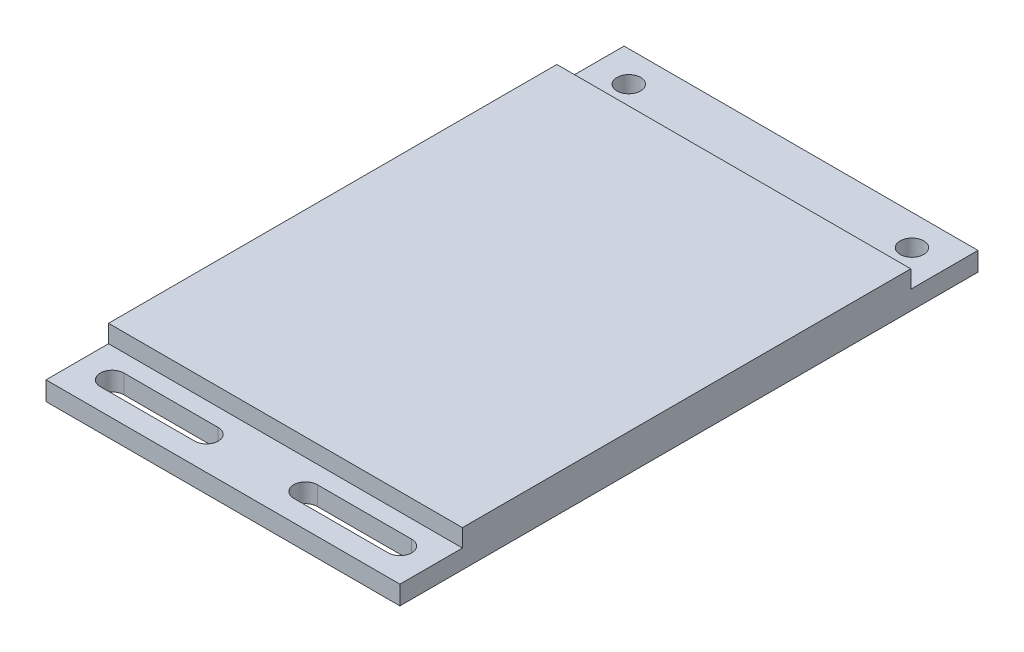
ISO-10303-21;
HEADER;
FILE_DESCRIPTION(('STEP AP214'),'2;1');
FILE_NAME('part.step','',(''),(''),'','','');
FILE_SCHEMA(('AUTOMOTIVE_DESIGN { 1 0 10303 214 1 1 1 1 }'));
ENDSEC;
DATA;
#1=APPLICATION_CONTEXT('core data for automotive mechanical design processes');
#2=APPLICATION_PROTOCOL_DEFINITION('international standard','automotive_design',2000,#1);
#3=PRODUCT_CONTEXT('',#1,'mechanical');
#4=PRODUCT('Part','Part','',(#3));
#5=PRODUCT_RELATED_PRODUCT_CATEGORY('part','',(#4));
#6=PRODUCT_DEFINITION_FORMATION('','',#4);
#7=PRODUCT_DEFINITION_CONTEXT('part definition',#1,'design');
#8=PRODUCT_DEFINITION('design','',#6,#7);
#9=PRODUCT_DEFINITION_SHAPE('','',#8);
#10=(LENGTH_UNIT() NAMED_UNIT(*) SI_UNIT(.MILLI.,.METRE.));
#11=(NAMED_UNIT(*) PLANE_ANGLE_UNIT() SI_UNIT($,.RADIAN.));
#12=(NAMED_UNIT(*) SI_UNIT($,.STERADIAN.) SOLID_ANGLE_UNIT());
#13=UNCERTAINTY_MEASURE_WITH_UNIT(LENGTH_MEASURE(1.E-05),#10,'distance_accuracy_value','');
#14=(GEOMETRIC_REPRESENTATION_CONTEXT(3) GLOBAL_UNCERTAINTY_ASSIGNED_CONTEXT((#13)) GLOBAL_UNIT_ASSIGNED_CONTEXT((#10,
#11,#12)) REPRESENTATION_CONTEXT('',''));
#15=CARTESIAN_POINT('',(0.,0.,0.));
#16=DIRECTION('',(0.,0.,1.));
#17=DIRECTION('',(1.,0.,0.));
#18=AXIS2_PLACEMENT_3D('',#15,#16,#17);
#19=CARTESIAN_POINT('',(0.,0.,0.));
#20=DIRECTION('',(0.,1.,0.));
#21=DIRECTION('',(0.,0.,1.));
#22=AXIS2_PLACEMENT_3D('',#19,#20,#21);
#23=PLANE('',#22);
#24=DIRECTION('',(0.,0.,1.));
#25=VECTOR('',#24,1.);
#26=CARTESIAN_POINT('',(30.,0.,0.));
#27=LINE('',#26,#25);
#28=CARTESIAN_POINT('',(30.,0.,0.));
#29=VERTEX_POINT('',#28);
#30=CARTESIAN_POINT('',(30.,0.,49.));
#31=VERTEX_POINT('',#30);
#32=EDGE_CURVE('E302',#29,#31,#27,.T.);
#33=ORIENTED_EDGE('',*,*,#32,.T.);
#34=DIRECTION('',(1.,0.,0.));
#35=VECTOR('',#34,1.);
#36=CARTESIAN_POINT('',(0.,0.,49.));
#37=LINE('',#36,#35);
#38=CARTESIAN_POINT('',(0.,0.,49.));
#39=VERTEX_POINT('',#38);
#40=EDGE_CURVE('E234',#39,#31,#37,.T.);
#41=ORIENTED_EDGE('',*,*,#40,.F.);
#42=DIRECTION('',(0.,0.,1.));
#43=VECTOR('',#42,1.);
#44=CARTESIAN_POINT('',(0.,0.,0.));
#45=LINE('',#44,#43);
#46=CARTESIAN_POINT('',(0.,0.,0.));
#47=VERTEX_POINT('',#46);
#48=EDGE_CURVE('E308',#47,#39,#45,.T.);
#49=ORIENTED_EDGE('',*,*,#48,.F.);
#50=DIRECTION('',(1.,0.,0.));
#51=VECTOR('',#50,1.);
#52=CARTESIAN_POINT('',(0.,0.,0.));
#53=LINE('',#52,#51);
#54=EDGE_CURVE('E305',#47,#29,#53,.T.);
#55=ORIENTED_EDGE('',*,*,#54,.T.);
#56=EDGE_LOOP('',(#33,#41,#49,#55));
#57=FACE_BOUND('',#56,.T.);
#58=CARTESIAN_POINT('',(3.,0.,2.6));
#59=DIRECTION('',(0.,1.,0.));
#60=DIRECTION('',(0.,0.,1.));
#61=AXIS2_PLACEMENT_3D('',#58,#59,#60);
#62=CIRCLE('',#61,1.);
#63=CARTESIAN_POINT('',(3.,0.,3.6));
#64=VERTEX_POINT('',#63);
#65=EDGE_CURVE('E299',#64,#64,#62,.T.);
#66=ORIENTED_EDGE('',*,*,#65,.T.);
#67=EDGE_LOOP('',(#66));
#68=FACE_BOUND('',#67,.T.);
#69=CARTESIAN_POINT('',(27.,0.,2.6));
#70=DIRECTION('',(0.,1.,0.));
#71=DIRECTION('',(0.,0.,1.));
#72=AXIS2_PLACEMENT_3D('',#69,#70,#71);
#73=CIRCLE('',#72,1.);
#74=CARTESIAN_POINT('',(27.,0.,3.6));
#75=VERTEX_POINT('',#74);
#76=EDGE_CURVE('E296',#75,#75,#73,.T.);
#77=ORIENTED_EDGE('',*,*,#76,.T.);
#78=EDGE_LOOP('',(#77));
#79=FACE_BOUND('',#78,.T.);
#80=CARTESIAN_POINT('',(10.8,0.,46.2));
#81=DIRECTION('',(0.,1.,0.));
#82=DIRECTION('',(0.,0.,1.));
#83=AXIS2_PLACEMENT_3D('',#80,#81,#82);
#84=CIRCLE('',#83,1.);
#85=CARTESIAN_POINT('',(10.8,0.,47.2));
#86=VERTEX_POINT('',#85);
#87=CARTESIAN_POINT('',(10.8,0.,45.2));
#88=VERTEX_POINT('',#87);
#89=EDGE_CURVE('E284',#86,#88,#84,.T.);
#90=ORIENTED_EDGE('',*,*,#89,.T.);
#91=DIRECTION('',(1.,0.,0.));
#92=VECTOR('',#91,1.);
#93=CARTESIAN_POINT('',(0.,0.,45.2));
#94=LINE('',#93,#92);
#95=CARTESIAN_POINT('',(2.80000000000001,0.,45.2));
#96=VERTEX_POINT('',#95);
#97=EDGE_CURVE('E293',#96,#88,#94,.T.);
#98=ORIENTED_EDGE('',*,*,#97,.F.);
#99=CARTESIAN_POINT('',(2.80000000000001,0.,46.2));
#100=DIRECTION('',(0.,1.,0.));
#101=DIRECTION('',(0.,0.,1.));
#102=AXIS2_PLACEMENT_3D('',#99,#100,#101);
#103=CIRCLE('',#102,1.);
#104=CARTESIAN_POINT('',(2.80000000000001,0.,47.2));
#105=VERTEX_POINT('',#104);
#106=EDGE_CURVE('E290',#96,#105,#103,.T.);
#107=ORIENTED_EDGE('',*,*,#106,.T.);
#108=DIRECTION('',(1.,0.,0.));
#109=VECTOR('',#108,1.);
#110=CARTESIAN_POINT('',(0.,0.,47.2));
#111=LINE('',#110,#109);
#112=EDGE_CURVE('E287',#105,#86,#111,.T.);
#113=ORIENTED_EDGE('',*,*,#112,.T.);
#114=EDGE_LOOP('',(#90,#98,#107,#113));
#115=FACE_BOUND('',#114,.T.);
#116=CARTESIAN_POINT('',(19.2,0.,46.2));
#117=DIRECTION('',(0.,1.,0.));
#118=DIRECTION('',(0.,0.,1.));
#119=AXIS2_PLACEMENT_3D('',#116,#117,#118);
#120=CIRCLE('',#119,1.);
#121=CARTESIAN_POINT('',(19.2,0.,45.2));
#122=VERTEX_POINT('',#121);
#123=CARTESIAN_POINT('',(19.2,0.,47.2));
#124=VERTEX_POINT('',#123);
#125=EDGE_CURVE('E229',#122,#124,#120,.T.);
#126=ORIENTED_EDGE('',*,*,#125,.T.);
#127=DIRECTION('',(1.,0.,0.));
#128=VECTOR('',#127,1.);
#129=CARTESIAN_POINT('',(0.,0.,47.2));
#130=LINE('',#129,#128);
#131=CARTESIAN_POINT('',(27.2,0.,47.2));
#132=VERTEX_POINT('',#131);
#133=EDGE_CURVE('E281',#124,#132,#130,.T.);
#134=ORIENTED_EDGE('',*,*,#133,.T.);
#135=CARTESIAN_POINT('',(27.2,0.,46.2));
#136=DIRECTION('',(0.,1.,0.));
#137=DIRECTION('',(0.,0.,1.));
#138=AXIS2_PLACEMENT_3D('',#135,#136,#137);
#139=CIRCLE('',#138,1.);
#140=CARTESIAN_POINT('',(27.2,0.,45.2));
#141=VERTEX_POINT('',#140);
#142=EDGE_CURVE('E278',#132,#141,#139,.T.);
#143=ORIENTED_EDGE('',*,*,#142,.T.);
#144=DIRECTION('',(1.,0.,0.));
#145=VECTOR('',#144,1.);
#146=CARTESIAN_POINT('',(0.,0.,45.2));
#147=LINE('',#146,#145);
#148=EDGE_CURVE('E275',#122,#141,#147,.T.);
#149=ORIENTED_EDGE('',*,*,#148,.F.);
#150=EDGE_LOOP('',(#126,#134,#143,#149));
#151=FACE_BOUND('',#150,.T.);
#152=DIRECTION('',(0.,0.,1.));
#153=VECTOR('',#152,1.);
#154=CARTESIAN_POINT('',(19.2,0.,40.5));
#155=LINE('',#154,#153);
#156=CARTESIAN_POINT('',(19.2,0.,35.5));
#157=VERTEX_POINT('',#156);
#158=CARTESIAN_POINT('',(19.2,0.,40.5));
#159=VERTEX_POINT('',#158);
#160=EDGE_CURVE('E196',#157,#159,#155,.T.);
#161=ORIENTED_EDGE('',*,*,#160,.F.);
#162=DIRECTION('',(1.,0.,0.));
#163=VECTOR('',#162,1.);
#164=CARTESIAN_POINT('',(19.2,0.,35.5));
#165=LINE('',#164,#163);
#166=CARTESIAN_POINT('',(10.8,0.,35.5));
#167=VERTEX_POINT('',#166);
#168=EDGE_CURVE('E193',#167,#157,#165,.T.);
#169=ORIENTED_EDGE('',*,*,#168,.F.);
#170=DIRECTION('',(0.,0.,-1.));
#171=VECTOR('',#170,1.);
#172=CARTESIAN_POINT('',(10.8,0.,40.5));
#173=LINE('',#172,#171);
#174=CARTESIAN_POINT('',(10.8,0.,40.5));
#175=VERTEX_POINT('',#174);
#176=EDGE_CURVE('E60',#175,#167,#173,.T.);
#177=ORIENTED_EDGE('',*,*,#176,.F.);
#178=DIRECTION('',(-1.,0.,0.));
#179=VECTOR('',#178,1.);
#180=CARTESIAN_POINT('',(19.2,0.,40.5));
#181=LINE('',#180,#179);
#182=EDGE_CURVE('E55',#159,#175,#181,.T.);
#183=ORIENTED_EDGE('',*,*,#182,.F.);
#184=EDGE_LOOP('',(#161,#169,#177,#183));
#185=FACE_BOUND('',#184,.T.);
#186=ADVANCED_FACE('F38',(#57,#68,#79,#115,#151,#185),#23,.F.);
#187=CARTESIAN_POINT('',(0.,1.6,0.));
#188=DIRECTION('',(0.,1.,0.));
#189=DIRECTION('',(0.,0.,1.));
#190=AXIS2_PLACEMENT_3D('',#187,#188,#189);
#191=PLANE('',#190);
#192=DIRECTION('',(-1.,0.,0.));
#193=VECTOR('',#192,1.);
#194=CARTESIAN_POINT('',(0.,1.6,5.7));
#195=LINE('',#194,#193);
#196=CARTESIAN_POINT('',(30.,1.6,5.7));
#197=VERTEX_POINT('',#196);
#198=CARTESIAN_POINT('',(0.,1.6,5.7));
#199=VERTEX_POINT('',#198);
#200=EDGE_CURVE('E200',#197,#199,#195,.T.);
#201=ORIENTED_EDGE('',*,*,#200,.F.);
#202=DIRECTION('',(0.,0.,1.));
#203=VECTOR('',#202,1.);
#204=CARTESIAN_POINT('',(30.,1.6,0.));
#205=LINE('',#204,#203);
#206=CARTESIAN_POINT('',(30.,1.6,0.));
#207=VERTEX_POINT('',#206);
#208=EDGE_CURVE('E260',#207,#197,#205,.T.);
#209=ORIENTED_EDGE('',*,*,#208,.F.);
#210=DIRECTION('',(1.,0.,0.));
#211=VECTOR('',#210,1.);
#212=CARTESIAN_POINT('',(0.,1.6,0.));
#213=LINE('',#212,#211);
#214=CARTESIAN_POINT('',(0.,1.6,0.));
#215=VERTEX_POINT('',#214);
#216=EDGE_CURVE('E263',#215,#207,#213,.T.);
#217=ORIENTED_EDGE('',*,*,#216,.F.);
#218=DIRECTION('',(0.,0.,1.));
#219=VECTOR('',#218,1.);
#220=CARTESIAN_POINT('',(0.,1.6,0.));
#221=LINE('',#220,#219);
#222=EDGE_CURVE('E267',#215,#199,#221,.T.);
#223=ORIENTED_EDGE('',*,*,#222,.T.);
#224=EDGE_LOOP('',(#201,#209,#217,#223));
#225=FACE_BOUND('',#224,.T.);
#226=CARTESIAN_POINT('',(3.,1.6,2.6));
#227=DIRECTION('',(0.,1.,0.));
#228=DIRECTION('',(0.,0.,1.));
#229=AXIS2_PLACEMENT_3D('',#226,#227,#228);
#230=CIRCLE('',#229,1.);
#231=CARTESIAN_POINT('',(3.,1.6,3.6));
#232=VERTEX_POINT('',#231);
#233=EDGE_CURVE('E256',#232,#232,#230,.T.);
#234=ORIENTED_EDGE('',*,*,#233,.F.);
#235=EDGE_LOOP('',(#234));
#236=FACE_BOUND('',#235,.T.);
#237=CARTESIAN_POINT('',(27.,1.6,2.6));
#238=DIRECTION('',(0.,1.,0.));
#239=DIRECTION('',(0.,0.,1.));
#240=AXIS2_PLACEMENT_3D('',#237,#238,#239);
#241=CIRCLE('',#240,1.);
#242=CARTESIAN_POINT('',(27.,1.6,3.6));
#243=VERTEX_POINT('',#242);
#244=EDGE_CURVE('E253',#243,#243,#241,.T.);
#245=ORIENTED_EDGE('',*,*,#244,.F.);
#246=EDGE_LOOP('',(#245));
#247=FACE_BOUND('',#246,.T.);
#248=ADVANCED_FACE('F359',(#225,#236,#247),#191,.T.);
#249=CARTESIAN_POINT('',(30.,1.6,0.));
#250=DIRECTION('',(1.,0.,0.));
#251=DIRECTION('',(0.,0.,-1.));
#252=AXIS2_PLACEMENT_3D('',#249,#250,#251);
#253=PLANE('',#252);
#254=ORIENTED_EDGE('',*,*,#32,.F.);
#255=DIRECTION('',(0.,-1.,0.));
#256=VECTOR('',#255,1.);
#257=CARTESIAN_POINT('',(30.,1.6,0.));
#258=LINE('',#257,#256);
#259=EDGE_CURVE('E11',#207,#29,#258,.T.);
#260=ORIENTED_EDGE('',*,*,#259,.F.);
#261=ORIENTED_EDGE('',*,*,#208,.T.);
#262=DIRECTION('',(0.,-1.,0.));
#263=VECTOR('',#262,1.);
#264=CARTESIAN_POINT('',(30.,3.1,5.7));
#265=LINE('',#264,#263);
#266=CARTESIAN_POINT('',(30.,3.1,5.7));
#267=VERTEX_POINT('',#266);
#268=EDGE_CURVE('E220',#267,#197,#265,.T.);
#269=ORIENTED_EDGE('',*,*,#268,.F.);
#270=DIRECTION('',(0.,0.,-1.));
#271=VECTOR('',#270,1.);
#272=CARTESIAN_POINT('',(30.,3.1,5.7));
#273=LINE('',#272,#271);
#274=CARTESIAN_POINT('',(30.,3.1,43.7));
#275=VERTEX_POINT('',#274);
#276=EDGE_CURVE('E211',#275,#267,#273,.T.);
#277=ORIENTED_EDGE('',*,*,#276,.F.);
#278=DIRECTION('',(0.,-1.,0.));
#279=VECTOR('',#278,1.);
#280=CARTESIAN_POINT('',(30.,3.1,43.7));
#281=LINE('',#280,#279);
#282=CARTESIAN_POINT('',(30.,1.6,43.7));
#283=VERTEX_POINT('',#282);
#284=EDGE_CURVE('E223',#275,#283,#281,.T.);
#285=ORIENTED_EDGE('',*,*,#284,.T.);
#286=CARTESIAN_POINT('',(30.,1.6,49.));
#287=VERTEX_POINT('',#286);
#288=EDGE_CURVE('E259',#283,#287,#205,.T.);
#289=ORIENTED_EDGE('',*,*,#288,.T.);
#290=DIRECTION('',(0.,-1.,0.));
#291=VECTOR('',#290,1.);
#292=CARTESIAN_POINT('',(30.,1.6,49.));
#293=LINE('',#292,#291);
#294=EDGE_CURVE('E313',#287,#31,#293,.T.);
#295=ORIENTED_EDGE('',*,*,#294,.T.);
#296=EDGE_LOOP('',(#254,#260,#261,#269,#277,#285,#289,#295));
#297=FACE_BOUND('',#296,.T.);
#298=ADVANCED_FACE('F365',(#297),#253,.T.);
#299=CARTESIAN_POINT('',(0.,1.6,0.));
#300=DIRECTION('',(0.,0.,-1.));
#301=DIRECTION('',(-1.,0.,0.));
#302=AXIS2_PLACEMENT_3D('',#299,#300,#301);
#303=PLANE('',#302);
#304=ORIENTED_EDGE('',*,*,#54,.F.);
#305=DIRECTION('',(0.,-1.,0.));
#306=VECTOR('',#305,1.);
#307=CARTESIAN_POINT('',(0.,1.6,0.));
#308=LINE('',#307,#306);
#309=EDGE_CURVE('E47',#215,#47,#308,.T.);
#310=ORIENTED_EDGE('',*,*,#309,.F.);
#311=ORIENTED_EDGE('',*,*,#216,.T.);
#312=ORIENTED_EDGE('',*,*,#259,.T.);
#313=EDGE_LOOP('',(#304,#310,#311,#312));
#314=FACE_BOUND('',#313,.T.);
#315=ADVANCED_FACE('F380',(#314),#303,.T.);
#316=CARTESIAN_POINT('',(0.,1.6,0.));
#317=DIRECTION('',(1.,0.,0.));
#318=DIRECTION('',(0.,0.,-1.));
#319=AXIS2_PLACEMENT_3D('',#316,#317,#318);
#320=PLANE('',#319);
#321=ORIENTED_EDGE('',*,*,#48,.T.);
#322=DIRECTION('',(0.,-1.,0.));
#323=VECTOR('',#322,1.);
#324=CARTESIAN_POINT('',(0.,1.6,49.));
#325=LINE('',#324,#323);
#326=CARTESIAN_POINT('',(0.,1.6,49.));
#327=VERTEX_POINT('',#326);
#328=EDGE_CURVE('E315',#327,#39,#325,.T.);
#329=ORIENTED_EDGE('',*,*,#328,.F.);
#330=CARTESIAN_POINT('',(0.,1.6,43.7));
#331=VERTEX_POINT('',#330);
#332=EDGE_CURVE('E266',#331,#327,#221,.T.);
#333=ORIENTED_EDGE('',*,*,#332,.F.);
#334=DIRECTION('',(0.,-1.,0.));
#335=VECTOR('',#334,1.);
#336=CARTESIAN_POINT('',(0.,3.1,43.7));
#337=LINE('',#336,#335);
#338=CARTESIAN_POINT('',(0.,3.1,43.7));
#339=VERTEX_POINT('',#338);
#340=EDGE_CURVE('E226',#339,#331,#337,.T.);
#341=ORIENTED_EDGE('',*,*,#340,.F.);
#342=DIRECTION('',(0.,0.,1.));
#343=VECTOR('',#342,1.);
#344=CARTESIAN_POINT('',(0.,3.1,5.7));
#345=LINE('',#344,#343);
#346=CARTESIAN_POINT('',(0.,3.1,5.7));
#347=VERTEX_POINT('',#346);
#348=EDGE_CURVE('E206',#347,#339,#345,.T.);
#349=ORIENTED_EDGE('',*,*,#348,.F.);
#350=DIRECTION('',(0.,-1.,0.));
#351=VECTOR('',#350,1.);
#352=CARTESIAN_POINT('',(0.,3.1,5.7));
#353=LINE('',#352,#351);
#354=EDGE_CURVE('E214',#347,#199,#353,.T.);
#355=ORIENTED_EDGE('',*,*,#354,.T.);
#356=ORIENTED_EDGE('',*,*,#222,.F.);
#357=ORIENTED_EDGE('',*,*,#309,.T.);
#358=EDGE_LOOP('',(#321,#329,#333,#341,#349,#355,#356,#357));
#359=FACE_BOUND('',#358,.T.);
#360=ADVANCED_FACE('F376',(#359),#320,.F.);
#361=CARTESIAN_POINT('',(10.8,1.6,46.2));
#362=DIRECTION('',(0.,-1.,0.));
#363=DIRECTION('',(0.,0.,-1.));
#364=AXIS2_PLACEMENT_3D('',#361,#362,#363);
#365=CYLINDRICAL_SURFACE('',#364,1.);
#366=ORIENTED_EDGE('',*,*,#89,.F.);
#367=DIRECTION('',(0.,-1.,0.));
#368=VECTOR('',#367,1.);
#369=CARTESIAN_POINT('',(10.8,1.6,47.2));
#370=LINE('',#369,#368);
#371=CARTESIAN_POINT('',(10.8,1.6,47.2));
#372=VERTEX_POINT('',#371);
#373=EDGE_CURVE('E316',#372,#86,#370,.T.);
#374=ORIENTED_EDGE('',*,*,#373,.F.);
#375=CARTESIAN_POINT('',(10.8,1.6,46.2));
#376=DIRECTION('',(0.,1.,0.));
#377=DIRECTION('',(0.,0.,1.));
#378=AXIS2_PLACEMENT_3D('',#375,#376,#377);
#379=CIRCLE('',#378,1.);
#380=CARTESIAN_POINT('',(10.8,1.6,45.2));
#381=VERTEX_POINT('',#380);
#382=EDGE_CURVE('E242',#372,#381,#379,.T.);
#383=ORIENTED_EDGE('',*,*,#382,.T.);
#384=DIRECTION('',(0.,-1.,0.));
#385=VECTOR('',#384,1.);
#386=CARTESIAN_POINT('',(10.8,1.6,45.2));
#387=LINE('',#386,#385);
#388=EDGE_CURVE('E320',#381,#88,#387,.T.);
#389=ORIENTED_EDGE('',*,*,#388,.T.);
#390=EDGE_LOOP('',(#366,#374,#383,#389));
#391=FACE_BOUND('',#390,.T.);
#392=ADVANCED_FACE('F379',(#391),#365,.F.);
#393=CARTESIAN_POINT('',(0.,1.6,47.2));
#394=DIRECTION('',(0.,0.,-1.));
#395=DIRECTION('',(-1.,0.,0.));
#396=AXIS2_PLACEMENT_3D('',#393,#394,#395);
#397=PLANE('',#396);
#398=ORIENTED_EDGE('',*,*,#112,.F.);
#399=DIRECTION('',(0.,-1.,0.));
#400=VECTOR('',#399,1.);
#401=CARTESIAN_POINT('',(2.80000000000001,1.6,47.2));
#402=LINE('',#401,#400);
#403=CARTESIAN_POINT('',(2.80000000000001,1.6,47.2));
#404=VERTEX_POINT('',#403);
#405=EDGE_CURVE('E324',#404,#105,#402,.T.);
#406=ORIENTED_EDGE('',*,*,#405,.F.);
#407=DIRECTION('',(1.,0.,0.));
#408=VECTOR('',#407,1.);
#409=CARTESIAN_POINT('',(0.,1.6,47.2));
#410=LINE('',#409,#408);
#411=EDGE_CURVE('E245',#404,#372,#410,.T.);
#412=ORIENTED_EDGE('',*,*,#411,.T.);
#413=ORIENTED_EDGE('',*,*,#373,.T.);
#414=EDGE_LOOP('',(#398,#406,#412,#413));
#415=FACE_BOUND('',#414,.T.);
#416=ADVANCED_FACE('F398',(#415),#397,.T.);
#417=CARTESIAN_POINT('',(2.80000000000001,1.6,46.2));
#418=DIRECTION('',(0.,-1.,0.));
#419=DIRECTION('',(0.,0.,-1.));
#420=AXIS2_PLACEMENT_3D('',#417,#418,#419);
#421=CYLINDRICAL_SURFACE('',#420,1.);
#422=ORIENTED_EDGE('',*,*,#106,.F.);
#423=DIRECTION('',(0.,-1.,0.));
#424=VECTOR('',#423,1.);
#425=CARTESIAN_POINT('',(2.80000000000001,1.6,45.2));
#426=LINE('',#425,#424);
#427=CARTESIAN_POINT('',(2.80000000000001,1.6,45.2));
#428=VERTEX_POINT('',#427);
#429=EDGE_CURVE('E322',#428,#96,#426,.T.);
#430=ORIENTED_EDGE('',*,*,#429,.F.);
#431=CARTESIAN_POINT('',(2.80000000000001,1.6,46.2));
#432=DIRECTION('',(0.,1.,0.));
#433=DIRECTION('',(0.,0.,1.));
#434=AXIS2_PLACEMENT_3D('',#431,#432,#433);
#435=CIRCLE('',#434,1.);
#436=EDGE_CURVE('E248',#428,#404,#435,.T.);
#437=ORIENTED_EDGE('',*,*,#436,.T.);
#438=ORIENTED_EDGE('',*,*,#405,.T.);
#439=EDGE_LOOP('',(#422,#430,#437,#438));
#440=FACE_BOUND('',#439,.T.);
#441=ADVANCED_FACE('F395',(#440),#421,.F.);
#442=CARTESIAN_POINT('',(19.2,1.6,46.2));
#443=DIRECTION('',(0.,-1.,0.));
#444=DIRECTION('',(0.,0.,-1.));
#445=AXIS2_PLACEMENT_3D('',#442,#443,#444);
#446=CYLINDRICAL_SURFACE('',#445,1.);
#447=ORIENTED_EDGE('',*,*,#125,.F.);
#448=DIRECTION('',(0.,-1.,0.));
#449=VECTOR('',#448,1.);
#450=CARTESIAN_POINT('',(19.2,1.6,45.2));
#451=LINE('',#450,#449);
#452=CARTESIAN_POINT('',(19.2,1.6,45.2));
#453=VERTEX_POINT('',#452);
#454=EDGE_CURVE('E42',#453,#122,#451,.T.);
#455=ORIENTED_EDGE('',*,*,#454,.F.);
#456=CARTESIAN_POINT('',(19.2,1.6,46.2));
#457=DIRECTION('',(0.,1.,0.));
#458=DIRECTION('',(0.,0.,1.));
#459=AXIS2_PLACEMENT_3D('',#456,#457,#458);
#460=CIRCLE('',#459,1.);
#461=CARTESIAN_POINT('',(19.2,1.6,47.2));
#462=VERTEX_POINT('',#461);
#463=EDGE_CURVE('E230',#453,#462,#460,.T.);
#464=ORIENTED_EDGE('',*,*,#463,.T.);
#465=DIRECTION('',(0.,-1.,0.));
#466=VECTOR('',#465,1.);
#467=CARTESIAN_POINT('',(19.2,1.6,47.2));
#468=LINE('',#467,#466);
#469=EDGE_CURVE('E272',#462,#124,#468,.T.);
#470=ORIENTED_EDGE('',*,*,#469,.T.);
#471=EDGE_LOOP('',(#447,#455,#464,#470));
#472=FACE_BOUND('',#471,.T.);
#473=ADVANCED_FACE('F40',(#472),#446,.F.);
#474=CARTESIAN_POINT('',(0.,1.6,45.2));
#475=DIRECTION('',(0.,0.,-1.));
#476=DIRECTION('',(-1.,0.,0.));
#477=AXIS2_PLACEMENT_3D('',#474,#475,#476);
#478=PLANE('',#477);
#479=ORIENTED_EDGE('',*,*,#148,.T.);
#480=DIRECTION('',(0.,-1.,0.));
#481=VECTOR('',#480,1.);
#482=CARTESIAN_POINT('',(27.2,1.6,45.2));
#483=LINE('',#482,#481);
#484=CARTESIAN_POINT('',(27.2,1.6,45.2));
#485=VERTEX_POINT('',#484);
#486=EDGE_CURVE('E329',#485,#141,#483,.T.);
#487=ORIENTED_EDGE('',*,*,#486,.F.);
#488=DIRECTION('',(1.,0.,0.));
#489=VECTOR('',#488,1.);
#490=CARTESIAN_POINT('',(0.,1.6,45.2));
#491=LINE('',#490,#489);
#492=EDGE_CURVE('E233',#453,#485,#491,.T.);
#493=ORIENTED_EDGE('',*,*,#492,.F.);
#494=ORIENTED_EDGE('',*,*,#454,.T.);
#495=EDGE_LOOP('',(#479,#487,#493,#494));
#496=FACE_BOUND('',#495,.T.);
#497=ADVANCED_FACE('F336',(#496),#478,.F.);
#498=CARTESIAN_POINT('',(27.2,1.6,46.2));
#499=DIRECTION('',(0.,-1.,0.));
#500=DIRECTION('',(0.,0.,-1.));
#501=AXIS2_PLACEMENT_3D('',#498,#499,#500);
#502=CYLINDRICAL_SURFACE('',#501,1.);
#503=ORIENTED_EDGE('',*,*,#142,.F.);
#504=DIRECTION('',(0.,-1.,0.));
#505=VECTOR('',#504,1.);
#506=CARTESIAN_POINT('',(27.2,1.6,47.2));
#507=LINE('',#506,#505);
#508=CARTESIAN_POINT('',(27.2,1.6,47.2));
#509=VERTEX_POINT('',#508);
#510=EDGE_CURVE('E328',#509,#132,#507,.T.);
#511=ORIENTED_EDGE('',*,*,#510,.F.);
#512=CARTESIAN_POINT('',(27.2,1.6,46.2));
#513=DIRECTION('',(0.,1.,0.));
#514=DIRECTION('',(0.,0.,1.));
#515=AXIS2_PLACEMENT_3D('',#512,#513,#514);
#516=CIRCLE('',#515,1.);
#517=EDGE_CURVE('E236',#509,#485,#516,.T.);
#518=ORIENTED_EDGE('',*,*,#517,.T.);
#519=ORIENTED_EDGE('',*,*,#486,.T.);
#520=EDGE_LOOP('',(#503,#511,#518,#519));
#521=FACE_BOUND('',#520,.T.);
#522=ADVANCED_FACE('F346',(#521),#502,.F.);
#523=CARTESIAN_POINT('',(3.,1.6,2.6));
#524=DIRECTION('',(0.,-1.,0.));
#525=DIRECTION('',(0.,0.,-1.));
#526=AXIS2_PLACEMENT_3D('',#523,#524,#525);
#527=CYLINDRICAL_SURFACE('',#526,1.);
#528=ORIENTED_EDGE('',*,*,#233,.T.);
#529=EDGE_LOOP('',(#528));
#530=FACE_BOUND('',#529,.T.);
#531=ORIENTED_EDGE('',*,*,#65,.F.);
#532=EDGE_LOOP('',(#531));
#533=FACE_BOUND('',#532,.T.);
#534=ADVANCED_FACE('F348',(#530,#533),#527,.F.);
#535=CARTESIAN_POINT('',(27.,1.6,2.6));
#536=DIRECTION('',(0.,-1.,0.));
#537=DIRECTION('',(0.,0.,-1.));
#538=AXIS2_PLACEMENT_3D('',#535,#536,#537);
#539=CYLINDRICAL_SURFACE('',#538,1.);
#540=ORIENTED_EDGE('',*,*,#244,.T.);
#541=EDGE_LOOP('',(#540));
#542=FACE_BOUND('',#541,.T.);
#543=ORIENTED_EDGE('',*,*,#76,.F.);
#544=EDGE_LOOP('',(#543));
#545=FACE_BOUND('',#544,.T.);
#546=ADVANCED_FACE('F354',(#542,#545),#539,.F.);
#547=CARTESIAN_POINT('',(0.,1.6,45.2));
#548=DIRECTION('',(0.,0.,-1.));
#549=DIRECTION('',(-1.,0.,0.));
#550=AXIS2_PLACEMENT_3D('',#547,#548,#549);
#551=PLANE('',#550);
#552=ORIENTED_EDGE('',*,*,#97,.T.);
#553=ORIENTED_EDGE('',*,*,#388,.F.);
#554=DIRECTION('',(1.,0.,0.));
#555=VECTOR('',#554,1.);
#556=CARTESIAN_POINT('',(0.,1.6,45.2));
#557=LINE('',#556,#555);
#558=EDGE_CURVE('E251',#428,#381,#557,.T.);
#559=ORIENTED_EDGE('',*,*,#558,.F.);
#560=ORIENTED_EDGE('',*,*,#429,.T.);
#561=EDGE_LOOP('',(#552,#553,#559,#560));
#562=FACE_BOUND('',#561,.T.);
#563=ADVANCED_FACE('F390',(#562),#551,.F.);
#564=CARTESIAN_POINT('',(0.,1.6,47.2));
#565=DIRECTION('',(0.,0.,-1.));
#566=DIRECTION('',(-1.,0.,0.));
#567=AXIS2_PLACEMENT_3D('',#564,#565,#566);
#568=PLANE('',#567);
#569=ORIENTED_EDGE('',*,*,#133,.F.);
#570=ORIENTED_EDGE('',*,*,#469,.F.);
#571=DIRECTION('',(1.,0.,0.));
#572=VECTOR('',#571,1.);
#573=CARTESIAN_POINT('',(0.,1.6,47.2));
#574=LINE('',#573,#572);
#575=EDGE_CURVE('E239',#462,#509,#574,.T.);
#576=ORIENTED_EDGE('',*,*,#575,.T.);
#577=ORIENTED_EDGE('',*,*,#510,.T.);
#578=EDGE_LOOP('',(#569,#570,#576,#577));
#579=FACE_BOUND('',#578,.T.);
#580=ADVANCED_FACE('F344',(#579),#568,.T.);
#581=CARTESIAN_POINT('',(0.,1.6,49.));
#582=DIRECTION('',(0.,0.,-1.));
#583=DIRECTION('',(-1.,0.,0.));
#584=AXIS2_PLACEMENT_3D('',#581,#582,#583);
#585=PLANE('',#584);
#586=ORIENTED_EDGE('',*,*,#40,.T.);
#587=ORIENTED_EDGE('',*,*,#294,.F.);
#588=DIRECTION('',(1.,0.,0.));
#589=VECTOR('',#588,1.);
#590=CARTESIAN_POINT('',(0.,1.6,49.));
#591=LINE('',#590,#589);
#592=EDGE_CURVE('E269',#327,#287,#591,.T.);
#593=ORIENTED_EDGE('',*,*,#592,.F.);
#594=ORIENTED_EDGE('',*,*,#328,.T.);
#595=EDGE_LOOP('',(#586,#587,#593,#594));
#596=FACE_BOUND('',#595,.T.);
#597=ADVANCED_FACE('F372',(#596),#585,.F.);
#598=DIRECTION('',(1.,0.,0.));
#599=VECTOR('',#598,1.);
#600=CARTESIAN_POINT('',(0.,1.6,43.7));
#601=LINE('',#600,#599);
#602=EDGE_CURVE('E197',#331,#283,#601,.T.);
#603=ORIENTED_EDGE('',*,*,#602,.F.);
#604=ORIENTED_EDGE('',*,*,#332,.T.);
#605=ORIENTED_EDGE('',*,*,#592,.T.);
#606=ORIENTED_EDGE('',*,*,#288,.F.);
#607=EDGE_LOOP('',(#603,#604,#605,#606));
#608=FACE_BOUND('',#607,.T.);
#609=ORIENTED_EDGE('',*,*,#463,.F.);
#610=ORIENTED_EDGE('',*,*,#492,.T.);
#611=ORIENTED_EDGE('',*,*,#517,.F.);
#612=ORIENTED_EDGE('',*,*,#575,.F.);
#613=EDGE_LOOP('',(#609,#610,#611,#612));
#614=FACE_BOUND('',#613,.T.);
#615=ORIENTED_EDGE('',*,*,#382,.F.);
#616=ORIENTED_EDGE('',*,*,#411,.F.);
#617=ORIENTED_EDGE('',*,*,#436,.F.);
#618=ORIENTED_EDGE('',*,*,#558,.T.);
#619=EDGE_LOOP('',(#615,#616,#617,#618));
#620=FACE_BOUND('',#619,.T.);
#621=ADVANCED_FACE('F368',(#608,#614,#620),#191,.T.);
#622=CARTESIAN_POINT('',(0.,3.1,43.7));
#623=DIRECTION('',(0.,0.,-1.));
#624=DIRECTION('',(-1.,0.,0.));
#625=AXIS2_PLACEMENT_3D('',#622,#623,#624);
#626=PLANE('',#625);
#627=ORIENTED_EDGE('',*,*,#602,.T.);
#628=ORIENTED_EDGE('',*,*,#284,.F.);
#629=DIRECTION('',(1.,0.,0.));
#630=VECTOR('',#629,1.);
#631=CARTESIAN_POINT('',(0.,3.1,43.7));
#632=LINE('',#631,#630);
#633=EDGE_CURVE('E209',#339,#275,#632,.T.);
#634=ORIENTED_EDGE('',*,*,#633,.F.);
#635=ORIENTED_EDGE('',*,*,#340,.T.);
#636=EDGE_LOOP('',(#627,#628,#634,#635));
#637=FACE_BOUND('',#636,.T.);
#638=ADVANCED_FACE('F421',(#637),#626,.F.);
#639=CARTESIAN_POINT('',(0.,3.1,5.7));
#640=DIRECTION('',(0.,0.,1.));
#641=DIRECTION('',(1.,0.,0.));
#642=AXIS2_PLACEMENT_3D('',#639,#640,#641);
#643=PLANE('',#642);
#644=ORIENTED_EDGE('',*,*,#200,.T.);
#645=ORIENTED_EDGE('',*,*,#354,.F.);
#646=DIRECTION('',(-1.,0.,0.));
#647=VECTOR('',#646,1.);
#648=CARTESIAN_POINT('',(0.,3.1,5.7));
#649=LINE('',#648,#647);
#650=EDGE_CURVE('E213',#267,#347,#649,.T.);
#651=ORIENTED_EDGE('',*,*,#650,.F.);
#652=ORIENTED_EDGE('',*,*,#268,.T.);
#653=EDGE_LOOP('',(#644,#645,#651,#652));
#654=FACE_BOUND('',#653,.T.);
#655=ADVANCED_FACE('F429',(#654),#643,.F.);
#656=CARTESIAN_POINT('',(0.,3.1,0.));
#657=DIRECTION('',(0.,1.,0.));
#658=DIRECTION('',(0.,0.,1.));
#659=AXIS2_PLACEMENT_3D('',#656,#657,#658);
#660=PLANE('',#659);
#661=ORIENTED_EDGE('',*,*,#348,.T.);
#662=ORIENTED_EDGE('',*,*,#633,.T.);
#663=ORIENTED_EDGE('',*,*,#276,.T.);
#664=ORIENTED_EDGE('',*,*,#650,.T.);
#665=EDGE_LOOP('',(#661,#662,#663,#664));
#666=FACE_BOUND('',#665,.T.);
#667=ADVANCED_FACE('F436',(#666),#660,.T.);
#668=CARTESIAN_POINT('',(19.2,-2.,40.5));
#669=DIRECTION('',(-1.,0.,0.));
#670=DIRECTION('',(0.,0.,1.));
#671=AXIS2_PLACEMENT_3D('',#668,#669,#670);
#672=PLANE('',#671);
#673=ORIENTED_EDGE('',*,*,#160,.T.);
#674=DIRECTION('',(0.,1.,0.));
#675=VECTOR('',#674,1.);
#676=CARTESIAN_POINT('',(19.2,-2.,40.5));
#677=LINE('',#676,#675);
#678=CARTESIAN_POINT('',(19.2,-2.,40.5));
#679=VERTEX_POINT('',#678);
#680=EDGE_CURVE('E177',#679,#159,#677,.T.);
#681=ORIENTED_EDGE('',*,*,#680,.F.);
#682=DIRECTION('',(0.,0.,1.));
#683=VECTOR('',#682,1.);
#684=CARTESIAN_POINT('',(19.2,-2.,40.5));
#685=LINE('',#684,#683);
#686=CARTESIAN_POINT('',(19.2,-2.,35.5));
#687=VERTEX_POINT('',#686);
#688=EDGE_CURVE('E184',#687,#679,#685,.T.);
#689=ORIENTED_EDGE('',*,*,#688,.F.);
#690=DIRECTION('',(0.,1.,0.));
#691=VECTOR('',#690,1.);
#692=CARTESIAN_POINT('',(19.2,-2.,35.5));
#693=LINE('',#692,#691);
#694=EDGE_CURVE('E588',#687,#157,#693,.T.);
#695=ORIENTED_EDGE('',*,*,#694,.T.);
#696=EDGE_LOOP('',(#673,#681,#689,#695));
#697=FACE_BOUND('',#696,.T.);
#698=ADVANCED_FACE('F195',(#697),#672,.F.);
#699=CARTESIAN_POINT('',(19.2,-2.,40.5));
#700=DIRECTION('',(0.,0.,-1.));
#701=DIRECTION('',(-1.,0.,0.));
#702=AXIS2_PLACEMENT_3D('',#699,#700,#701);
#703=PLANE('',#702);
#704=ORIENTED_EDGE('',*,*,#182,.T.);
#705=DIRECTION('',(0.,1.,0.));
#706=VECTOR('',#705,1.);
#707=CARTESIAN_POINT('',(10.8,-2.,40.5));
#708=LINE('',#707,#706);
#709=CARTESIAN_POINT('',(10.8,-2.,40.5));
#710=VERTEX_POINT('',#709);
#711=EDGE_CURVE('E180',#710,#175,#708,.T.);
#712=ORIENTED_EDGE('',*,*,#711,.F.);
#713=DIRECTION('',(-1.,0.,0.));
#714=VECTOR('',#713,1.);
#715=CARTESIAN_POINT('',(19.2,-2.,40.5));
#716=LINE('',#715,#714);
#717=EDGE_CURVE('E173',#679,#710,#716,.T.);
#718=ORIENTED_EDGE('',*,*,#717,.F.);
#719=ORIENTED_EDGE('',*,*,#680,.T.);
#720=EDGE_LOOP('',(#704,#712,#718,#719));
#721=FACE_BOUND('',#720,.T.);
#722=ADVANCED_FACE('F175',(#721),#703,.F.);
#723=CARTESIAN_POINT('',(10.8,-2.,40.5));
#724=DIRECTION('',(1.,0.,0.));
#725=DIRECTION('',(0.,0.,-1.));
#726=AXIS2_PLACEMENT_3D('',#723,#724,#725);
#727=PLANE('',#726);
#728=ORIENTED_EDGE('',*,*,#176,.T.);
#729=DIRECTION('',(0.,1.,0.));
#730=VECTOR('',#729,1.);
#731=CARTESIAN_POINT('',(10.8,-2.,35.5));
#732=LINE('',#731,#730);
#733=CARTESIAN_POINT('',(10.8,-2.,35.5));
#734=VERTEX_POINT('',#733);
#735=EDGE_CURVE('E202',#734,#167,#732,.T.);
#736=ORIENTED_EDGE('',*,*,#735,.F.);
#737=DIRECTION('',(0.,0.,-1.));
#738=VECTOR('',#737,1.);
#739=CARTESIAN_POINT('',(10.8,-2.,40.5));
#740=LINE('',#739,#738);
#741=EDGE_CURVE('E183',#710,#734,#740,.T.);
#742=ORIENTED_EDGE('',*,*,#741,.F.);
#743=ORIENTED_EDGE('',*,*,#711,.T.);
#744=EDGE_LOOP('',(#728,#736,#742,#743));
#745=FACE_BOUND('',#744,.T.);
#746=ADVANCED_FACE('F457',(#745),#727,.F.);
#747=CARTESIAN_POINT('',(19.2,-2.,35.5));
#748=DIRECTION('',(0.,0.,1.));
#749=DIRECTION('',(1.,0.,0.));
#750=AXIS2_PLACEMENT_3D('',#747,#748,#749);
#751=PLANE('',#750);
#752=ORIENTED_EDGE('',*,*,#168,.T.);
#753=ORIENTED_EDGE('',*,*,#694,.F.);
#754=DIRECTION('',(1.,0.,0.));
#755=VECTOR('',#754,1.);
#756=CARTESIAN_POINT('',(19.2,-2.,35.5));
#757=LINE('',#756,#755);
#758=EDGE_CURVE('E189',#734,#687,#757,.T.);
#759=ORIENTED_EDGE('',*,*,#758,.F.);
#760=ORIENTED_EDGE('',*,*,#735,.T.);
#761=EDGE_LOOP('',(#752,#753,#759,#760));
#762=FACE_BOUND('',#761,.T.);
#763=ADVANCED_FACE('F464',(#762),#751,.F.);
#764=CARTESIAN_POINT('',(0.,-2.,0.));
#765=DIRECTION('',(0.,1.,0.));
#766=DIRECTION('',(0.,0.,1.));
#767=AXIS2_PLACEMENT_3D('',#764,#765,#766);
#768=PLANE('',#767);
#769=ORIENTED_EDGE('',*,*,#688,.T.);
#770=ORIENTED_EDGE('',*,*,#717,.T.);
#771=ORIENTED_EDGE('',*,*,#741,.T.);
#772=ORIENTED_EDGE('',*,*,#758,.T.);
#773=EDGE_LOOP('',(#769,#770,#771,#772));
#774=FACE_BOUND('',#773,.T.);
#775=ADVANCED_FACE('F187',(#774),#768,.F.);
#776=CLOSED_SHELL('',(#186,#248,#298,#315,#360,#392,#416,#441,#473,#497,#522,#534,#546,#563,
#580,#597,#621,#638,#655,#667,#698,#722,#746,#763,#775));
#777=MANIFOLD_SOLID_BREP('B2',#776);
#778=ADVANCED_BREP_SHAPE_REPRESENTATION('',(#18,#777),#14);
#779=SHAPE_DEFINITION_REPRESENTATION(#9,#778);
ENDSEC;
END-ISO-10303-21;
